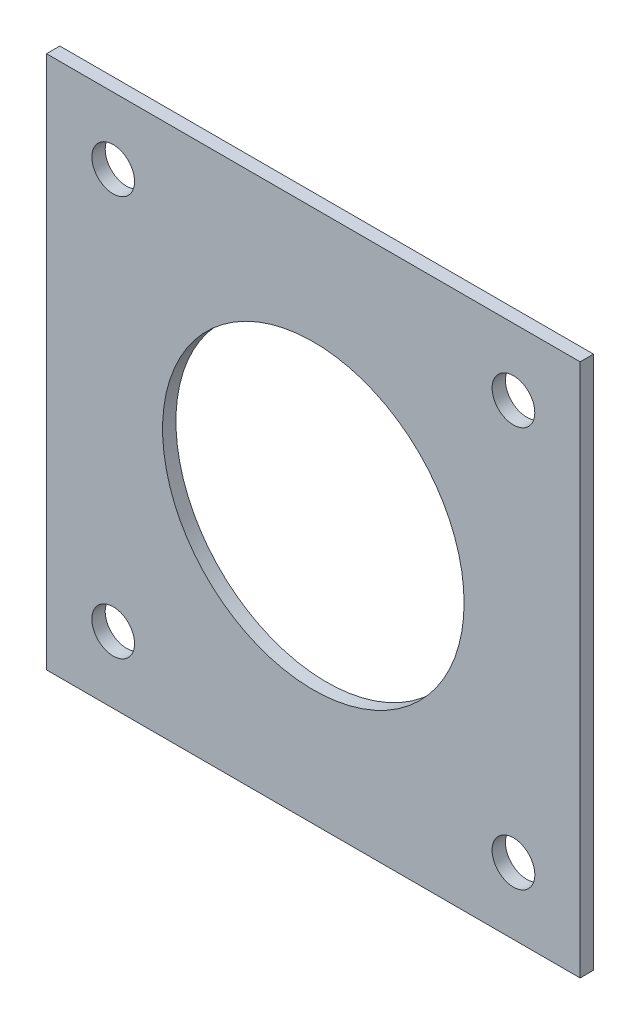
ISO-10303-21;
HEADER;
FILE_DESCRIPTION(('STEP AP214'),'2;1');
FILE_NAME('part.step','',(''),(''),'','','');
FILE_SCHEMA(('AUTOMOTIVE_DESIGN { 1 0 10303 214 1 1 1 1 }'));
ENDSEC;
DATA;
#1=APPLICATION_CONTEXT('core data for automotive mechanical design processes');
#2=APPLICATION_PROTOCOL_DEFINITION('international standard','automotive_design',2000,#1);
#3=PRODUCT_CONTEXT('',#1,'mechanical');
#4=PRODUCT('Part','Part','',(#3));
#5=PRODUCT_RELATED_PRODUCT_CATEGORY('part','',(#4));
#6=PRODUCT_DEFINITION_FORMATION('','',#4);
#7=PRODUCT_DEFINITION_CONTEXT('part definition',#1,'design');
#8=PRODUCT_DEFINITION('design','',#6,#7);
#9=PRODUCT_DEFINITION_SHAPE('','',#8);
#10=(LENGTH_UNIT() NAMED_UNIT(*) SI_UNIT(.MILLI.,.METRE.));
#11=(NAMED_UNIT(*) PLANE_ANGLE_UNIT() SI_UNIT($,.RADIAN.));
#12=(NAMED_UNIT(*) SI_UNIT($,.STERADIAN.) SOLID_ANGLE_UNIT());
#13=UNCERTAINTY_MEASURE_WITH_UNIT(LENGTH_MEASURE(1.E-05),#10,'distance_accuracy_value','');
#14=(GEOMETRIC_REPRESENTATION_CONTEXT(3) GLOBAL_UNCERTAINTY_ASSIGNED_CONTEXT((#13)) GLOBAL_UNIT_ASSIGNED_CONTEXT((#10,
#11,#12)) REPRESENTATION_CONTEXT('',''));
#15=CARTESIAN_POINT('',(0.,0.,0.));
#16=DIRECTION('',(0.,0.,1.));
#17=DIRECTION('',(1.,0.,0.));
#18=AXIS2_PLACEMENT_3D('',#15,#16,#17);
#19=CARTESIAN_POINT('',(0.,0.,0.635));
#20=DIRECTION('',(0.,0.,-1.));
#21=DIRECTION('',(-1.,0.,0.));
#22=AXIS2_PLACEMENT_3D('',#19,#20,#21);
#23=PLANE('',#22);
#24=DIRECTION('',(0.,1.,0.));
#25=VECTOR('',#24,1.);
#26=CARTESIAN_POINT('',(25.4,-25.4,0.635));
#27=LINE('',#26,#25);
#28=CARTESIAN_POINT('',(25.4,-25.4,0.635));
#29=VERTEX_POINT('',#28);
#30=CARTESIAN_POINT('',(25.4,25.4,0.635));
#31=VERTEX_POINT('',#30);
#32=EDGE_CURVE('E84',#29,#31,#27,.T.);
#33=ORIENTED_EDGE('',*,*,#32,.T.);
#34=DIRECTION('',(-1.,0.,0.));
#35=VECTOR('',#34,1.);
#36=CARTESIAN_POINT('',(-25.4,25.4,0.635));
#37=LINE('',#36,#35);
#38=CARTESIAN_POINT('',(-25.4,25.4,0.635));
#39=VERTEX_POINT('',#38);
#40=EDGE_CURVE('E79',#31,#39,#37,.T.);
#41=ORIENTED_EDGE('',*,*,#40,.T.);
#42=DIRECTION('',(0.,-1.,0.));
#43=VECTOR('',#42,1.);
#44=CARTESIAN_POINT('',(-25.4,-25.4,0.635));
#45=LINE('',#44,#43);
#46=CARTESIAN_POINT('',(-25.4,-25.4,0.635));
#47=VERTEX_POINT('',#46);
#48=EDGE_CURVE('E82',#39,#47,#45,.T.);
#49=ORIENTED_EDGE('',*,*,#48,.T.);
#50=DIRECTION('',(1.,0.,0.));
#51=VECTOR('',#50,1.);
#52=CARTESIAN_POINT('',(-25.4,-25.4,0.635));
#53=LINE('',#52,#51);
#54=EDGE_CURVE('E49',#47,#29,#53,.T.);
#55=ORIENTED_EDGE('',*,*,#54,.T.);
#56=EDGE_LOOP('',(#33,#41,#49,#55));
#57=FACE_BOUND('',#56,.T.);
#58=CARTESIAN_POINT('',(0.,0.,0.635));
#59=DIRECTION('',(0.,0.,1.));
#60=DIRECTION('',(1.,0.,0.));
#61=AXIS2_PLACEMENT_3D('',#58,#59,#60);
#62=CIRCLE('',#61,14.351);
#63=CARTESIAN_POINT('',(14.351,0.,0.635));
#64=VERTEX_POINT('',#63);
#65=EDGE_CURVE('E99',#64,#64,#62,.T.);
#66=ORIENTED_EDGE('',*,*,#65,.F.);
#67=EDGE_LOOP('',(#66));
#68=FACE_BOUND('',#67,.T.);
#69=CARTESIAN_POINT('',(19.05,19.05,0.635));
#70=DIRECTION('',(0.,0.,1.));
#71=DIRECTION('',(1.,0.,0.));
#72=AXIS2_PLACEMENT_3D('',#69,#70,#71);
#73=CIRCLE('',#72,2.032);
#74=CARTESIAN_POINT('',(21.082,19.05,0.635));
#75=VERTEX_POINT('',#74);
#76=EDGE_CURVE('E114',#75,#75,#73,.T.);
#77=ORIENTED_EDGE('',*,*,#76,.F.);
#78=EDGE_LOOP('',(#77));
#79=FACE_BOUND('',#78,.T.);
#80=CARTESIAN_POINT('',(-19.05,19.05,0.635));
#81=DIRECTION('',(0.,0.,1.));
#82=DIRECTION('',(-1.,0.,0.));
#83=AXIS2_PLACEMENT_3D('',#80,#81,#82);
#84=CIRCLE('',#83,2.032);
#85=CARTESIAN_POINT('',(-21.082,19.05,0.635));
#86=VERTEX_POINT('',#85);
#87=EDGE_CURVE('E120',#86,#86,#84,.T.);
#88=ORIENTED_EDGE('',*,*,#87,.F.);
#89=EDGE_LOOP('',(#88));
#90=FACE_BOUND('',#89,.T.);
#91=CARTESIAN_POINT('',(19.05,-19.05,0.635));
#92=DIRECTION('',(0.,0.,1.));
#93=DIRECTION('',(-1.,0.,0.));
#94=AXIS2_PLACEMENT_3D('',#91,#92,#93);
#95=CIRCLE('',#94,2.032);
#96=CARTESIAN_POINT('',(17.018,-19.05,0.635));
#97=VERTEX_POINT('',#96);
#98=EDGE_CURVE('E126',#97,#97,#95,.T.);
#99=ORIENTED_EDGE('',*,*,#98,.F.);
#100=EDGE_LOOP('',(#99));
#101=FACE_BOUND('',#100,.T.);
#102=CARTESIAN_POINT('',(-19.05,-19.05,0.635));
#103=DIRECTION('',(0.,0.,1.));
#104=DIRECTION('',(1.,0.,0.));
#105=AXIS2_PLACEMENT_3D('',#102,#103,#104);
#106=CIRCLE('',#105,2.032);
#107=CARTESIAN_POINT('',(-17.018,-19.05,0.635));
#108=VERTEX_POINT('',#107);
#109=EDGE_CURVE('E132',#108,#108,#106,.T.);
#110=ORIENTED_EDGE('',*,*,#109,.F.);
#111=EDGE_LOOP('',(#110));
#112=FACE_BOUND('',#111,.T.);
#113=ADVANCED_FACE('F32',(#57,#68,#79,#90,#101,#112),#23,.F.);
#114=CARTESIAN_POINT('',(0.,0.,-0.635));
#115=DIRECTION('',(0.,0.,-1.));
#116=DIRECTION('',(-1.,0.,0.));
#117=AXIS2_PLACEMENT_3D('',#114,#115,#116);
#118=PLANE('',#117);
#119=CARTESIAN_POINT('',(19.05,-19.05,-0.635));
#120=DIRECTION('',(0.,0.,1.));
#121=DIRECTION('',(-1.,0.,0.));
#122=AXIS2_PLACEMENT_3D('',#119,#120,#121);
#123=CIRCLE('',#122,2.032);
#124=CARTESIAN_POINT('',(17.018,-19.05,-0.635));
#125=VERTEX_POINT('',#124);
#126=EDGE_CURVE('E129',#125,#125,#123,.T.);
#127=ORIENTED_EDGE('',*,*,#126,.T.);
#128=EDGE_LOOP('',(#127));
#129=FACE_BOUND('',#128,.T.);
#130=CARTESIAN_POINT('',(19.05,19.05,-0.635));
#131=DIRECTION('',(0.,0.,1.));
#132=DIRECTION('',(1.,0.,0.));
#133=AXIS2_PLACEMENT_3D('',#130,#131,#132);
#134=CIRCLE('',#133,2.032);
#135=CARTESIAN_POINT('',(21.082,19.05,-0.635));
#136=VERTEX_POINT('',#135);
#137=EDGE_CURVE('E117',#136,#136,#134,.T.);
#138=ORIENTED_EDGE('',*,*,#137,.T.);
#139=EDGE_LOOP('',(#138));
#140=FACE_BOUND('',#139,.T.);
#141=DIRECTION('',(0.,1.,0.));
#142=VECTOR('',#141,1.);
#143=CARTESIAN_POINT('',(25.4,-25.4,-0.635));
#144=LINE('',#143,#142);
#145=CARTESIAN_POINT('',(25.4,-25.4,-0.635));
#146=VERTEX_POINT('',#145);
#147=CARTESIAN_POINT('',(25.4,25.4,-0.635));
#148=VERTEX_POINT('',#147);
#149=EDGE_CURVE('E96',#146,#148,#144,.T.);
#150=ORIENTED_EDGE('',*,*,#149,.F.);
#151=DIRECTION('',(1.,0.,0.));
#152=VECTOR('',#151,1.);
#153=CARTESIAN_POINT('',(-25.4,-25.4,-0.635));
#154=LINE('',#153,#152);
#155=CARTESIAN_POINT('',(-25.4,-25.4,-0.635));
#156=VERTEX_POINT('',#155);
#157=EDGE_CURVE('E72',#156,#146,#154,.T.);
#158=ORIENTED_EDGE('',*,*,#157,.F.);
#159=DIRECTION('',(0.,-1.,0.));
#160=VECTOR('',#159,1.);
#161=CARTESIAN_POINT('',(-25.4,-25.4,-0.635));
#162=LINE('',#161,#160);
#163=CARTESIAN_POINT('',(-25.4,25.4,-0.635));
#164=VERTEX_POINT('',#163);
#165=EDGE_CURVE('E66',#164,#156,#162,.T.);
#166=ORIENTED_EDGE('',*,*,#165,.F.);
#167=DIRECTION('',(-1.,0.,0.));
#168=VECTOR('',#167,1.);
#169=CARTESIAN_POINT('',(-25.4,25.4,-0.635));
#170=LINE('',#169,#168);
#171=EDGE_CURVE('E88',#148,#164,#170,.T.);
#172=ORIENTED_EDGE('',*,*,#171,.F.);
#173=EDGE_LOOP('',(#150,#158,#166,#172));
#174=FACE_BOUND('',#173,.T.);
#175=CARTESIAN_POINT('',(0.,0.,-0.635));
#176=DIRECTION('',(0.,0.,1.));
#177=DIRECTION('',(1.,0.,0.));
#178=AXIS2_PLACEMENT_3D('',#175,#176,#177);
#179=CIRCLE('',#178,14.351);
#180=CARTESIAN_POINT('',(14.351,0.,-0.635));
#181=VERTEX_POINT('',#180);
#182=EDGE_CURVE('E111',#181,#181,#179,.T.);
#183=ORIENTED_EDGE('',*,*,#182,.T.);
#184=EDGE_LOOP('',(#183));
#185=FACE_BOUND('',#184,.T.);
#186=CARTESIAN_POINT('',(-19.05,19.05,-0.635));
#187=DIRECTION('',(0.,0.,1.));
#188=DIRECTION('',(-1.,0.,0.));
#189=AXIS2_PLACEMENT_3D('',#186,#187,#188);
#190=CIRCLE('',#189,2.032);
#191=CARTESIAN_POINT('',(-21.082,19.05,-0.635));
#192=VERTEX_POINT('',#191);
#193=EDGE_CURVE('E123',#192,#192,#190,.T.);
#194=ORIENTED_EDGE('',*,*,#193,.T.);
#195=EDGE_LOOP('',(#194));
#196=FACE_BOUND('',#195,.T.);
#197=CARTESIAN_POINT('',(-19.05,-19.05,-0.635));
#198=DIRECTION('',(0.,0.,1.));
#199=DIRECTION('',(1.,0.,0.));
#200=AXIS2_PLACEMENT_3D('',#197,#198,#199);
#201=CIRCLE('',#200,2.032);
#202=CARTESIAN_POINT('',(-17.018,-19.05,-0.635));
#203=VERTEX_POINT('',#202);
#204=EDGE_CURVE('E135',#203,#203,#201,.T.);
#205=ORIENTED_EDGE('',*,*,#204,.T.);
#206=EDGE_LOOP('',(#205));
#207=FACE_BOUND('',#206,.T.);
#208=ADVANCED_FACE('F107',(#129,#140,#174,#185,#196,#207),#118,.T.);
#209=CARTESIAN_POINT('',(25.4,-25.4,0.635));
#210=DIRECTION('',(-1.,0.,0.));
#211=DIRECTION('',(0.,0.,1.));
#212=AXIS2_PLACEMENT_3D('',#209,#210,#211);
#213=PLANE('',#212);
#214=ORIENTED_EDGE('',*,*,#149,.T.);
#215=DIRECTION('',(0.,0.,-1.));
#216=VECTOR('',#215,1.);
#217=CARTESIAN_POINT('',(25.4,25.4,0.635));
#218=LINE('',#217,#216);
#219=EDGE_CURVE('E11',#31,#148,#218,.T.);
#220=ORIENTED_EDGE('',*,*,#219,.F.);
#221=ORIENTED_EDGE('',*,*,#32,.F.);
#222=DIRECTION('',(0.,0.,-1.));
#223=VECTOR('',#222,1.);
#224=CARTESIAN_POINT('',(25.4,-25.4,0.635));
#225=LINE('',#224,#223);
#226=EDGE_CURVE('E92',#29,#146,#225,.T.);
#227=ORIENTED_EDGE('',*,*,#226,.T.);
#228=EDGE_LOOP('',(#214,#220,#221,#227));
#229=FACE_BOUND('',#228,.T.);
#230=ADVANCED_FACE('F34',(#229),#213,.F.);
#231=CARTESIAN_POINT('',(-25.4,25.4,0.635));
#232=DIRECTION('',(0.,-1.,0.));
#233=DIRECTION('',(0.,0.,-1.));
#234=AXIS2_PLACEMENT_3D('',#231,#232,#233);
#235=PLANE('',#234);
#236=ORIENTED_EDGE('',*,*,#171,.T.);
#237=DIRECTION('',(0.,0.,-1.));
#238=VECTOR('',#237,1.);
#239=CARTESIAN_POINT('',(-25.4,25.4,0.635));
#240=LINE('',#239,#238);
#241=EDGE_CURVE('E41',#39,#164,#240,.T.);
#242=ORIENTED_EDGE('',*,*,#241,.F.);
#243=ORIENTED_EDGE('',*,*,#40,.F.);
#244=ORIENTED_EDGE('',*,*,#219,.T.);
#245=EDGE_LOOP('',(#236,#242,#243,#244));
#246=FACE_BOUND('',#245,.T.);
#247=ADVANCED_FACE('F87',(#246),#235,.F.);
#248=CARTESIAN_POINT('',(-25.4,-25.4,0.635));
#249=DIRECTION('',(1.,0.,0.));
#250=DIRECTION('',(0.,0.,-1.));
#251=AXIS2_PLACEMENT_3D('',#248,#249,#250);
#252=PLANE('',#251);
#253=ORIENTED_EDGE('',*,*,#165,.T.);
#254=DIRECTION('',(0.,0.,-1.));
#255=VECTOR('',#254,1.);
#256=CARTESIAN_POINT('',(-25.4,-25.4,0.635));
#257=LINE('',#256,#255);
#258=EDGE_CURVE('E89',#47,#156,#257,.T.);
#259=ORIENTED_EDGE('',*,*,#258,.F.);
#260=ORIENTED_EDGE('',*,*,#48,.F.);
#261=ORIENTED_EDGE('',*,*,#241,.T.);
#262=EDGE_LOOP('',(#253,#259,#260,#261));
#263=FACE_BOUND('',#262,.T.);
#264=ADVANCED_FACE('F90',(#263),#252,.F.);
#265=CARTESIAN_POINT('',(-25.4,-25.4,0.635));
#266=DIRECTION('',(0.,1.,0.));
#267=DIRECTION('',(0.,0.,1.));
#268=AXIS2_PLACEMENT_3D('',#265,#266,#267);
#269=PLANE('',#268);
#270=ORIENTED_EDGE('',*,*,#157,.T.);
#271=ORIENTED_EDGE('',*,*,#226,.F.);
#272=ORIENTED_EDGE('',*,*,#54,.F.);
#273=ORIENTED_EDGE('',*,*,#258,.T.);
#274=EDGE_LOOP('',(#270,#271,#272,#273));
#275=FACE_BOUND('',#274,.T.);
#276=ADVANCED_FACE('F104',(#275),#269,.F.);
#277=CARTESIAN_POINT('',(0.,0.,0.635));
#278=DIRECTION('',(0.,0.,-1.));
#279=DIRECTION('',(-1.,0.,0.));
#280=AXIS2_PLACEMENT_3D('',#277,#278,#279);
#281=CYLINDRICAL_SURFACE('',#280,14.351);
#282=ORIENTED_EDGE('',*,*,#65,.T.);
#283=EDGE_LOOP('',(#282));
#284=FACE_BOUND('',#283,.T.);
#285=ORIENTED_EDGE('',*,*,#182,.F.);
#286=EDGE_LOOP('',(#285));
#287=FACE_BOUND('',#286,.T.);
#288=ADVANCED_FACE('F152',(#284,#287),#281,.F.);
#289=CARTESIAN_POINT('',(19.05,19.05,0.635));
#290=DIRECTION('',(0.,0.,-1.));
#291=DIRECTION('',(-1.,0.,0.));
#292=AXIS2_PLACEMENT_3D('',#289,#290,#291);
#293=CYLINDRICAL_SURFACE('',#292,2.032);
#294=ORIENTED_EDGE('',*,*,#76,.T.);
#295=EDGE_LOOP('',(#294));
#296=FACE_BOUND('',#295,.T.);
#297=ORIENTED_EDGE('',*,*,#137,.F.);
#298=EDGE_LOOP('',(#297));
#299=FACE_BOUND('',#298,.T.);
#300=ADVANCED_FACE('F198',(#296,#299),#293,.F.);
#301=CARTESIAN_POINT('',(-19.05,19.05,0.635));
#302=DIRECTION('',(0.,0.,-1.));
#303=DIRECTION('',(-1.,0.,0.));
#304=AXIS2_PLACEMENT_3D('',#301,#302,#303);
#305=CYLINDRICAL_SURFACE('',#304,2.032);
#306=ORIENTED_EDGE('',*,*,#87,.T.);
#307=EDGE_LOOP('',(#306));
#308=FACE_BOUND('',#307,.T.);
#309=ORIENTED_EDGE('',*,*,#193,.F.);
#310=EDGE_LOOP('',(#309));
#311=FACE_BOUND('',#310,.T.);
#312=ADVANCED_FACE('F206',(#308,#311),#305,.F.);
#313=CARTESIAN_POINT('',(19.05,-19.05,0.635));
#314=DIRECTION('',(0.,0.,-1.));
#315=DIRECTION('',(-1.,0.,0.));
#316=AXIS2_PLACEMENT_3D('',#313,#314,#315);
#317=CYLINDRICAL_SURFACE('',#316,2.032);
#318=ORIENTED_EDGE('',*,*,#98,.T.);
#319=EDGE_LOOP('',(#318));
#320=FACE_BOUND('',#319,.T.);
#321=ORIENTED_EDGE('',*,*,#126,.F.);
#322=EDGE_LOOP('',(#321));
#323=FACE_BOUND('',#322,.T.);
#324=ADVANCED_FACE('F214',(#320,#323),#317,.F.);
#325=CARTESIAN_POINT('',(-19.05,-19.05,0.635));
#326=DIRECTION('',(0.,0.,-1.));
#327=DIRECTION('',(-1.,0.,0.));
#328=AXIS2_PLACEMENT_3D('',#325,#326,#327);
#329=CYLINDRICAL_SURFACE('',#328,2.032);
#330=ORIENTED_EDGE('',*,*,#109,.T.);
#331=EDGE_LOOP('',(#330));
#332=FACE_BOUND('',#331,.T.);
#333=ORIENTED_EDGE('',*,*,#204,.F.);
#334=EDGE_LOOP('',(#333));
#335=FACE_BOUND('',#334,.T.);
#336=ADVANCED_FACE('F141',(#332,#335),#329,.F.);
#337=CLOSED_SHELL('',(#113,#208,#230,#247,#264,#276,#288,#300,#312,#324,#336));
#338=MANIFOLD_SOLID_BREP('B2',#337);
#339=ADVANCED_BREP_SHAPE_REPRESENTATION('',(#18,#338),#14);
#340=SHAPE_DEFINITION_REPRESENTATION(#9,#339);
ENDSEC;
END-ISO-10303-21;
